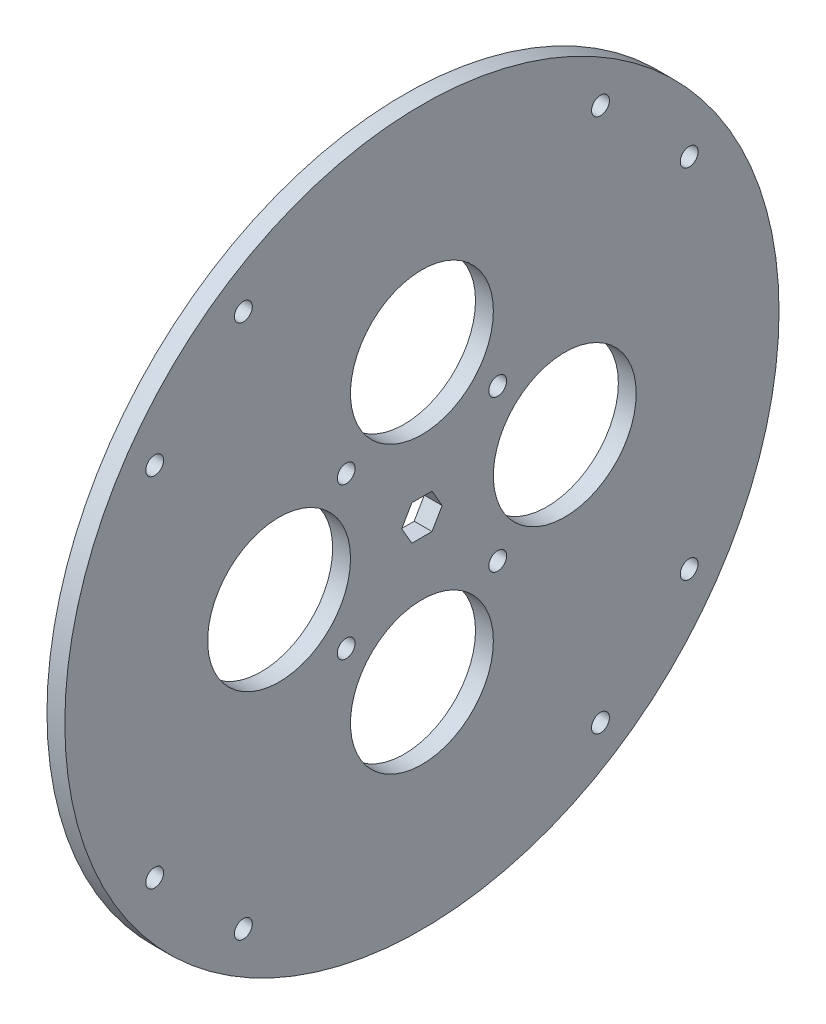
ISO-10303-21;
HEADER;
FILE_DESCRIPTION(('STEP AP214'),'2;1');
FILE_NAME('part.step','',(''),(''),'','','');
FILE_SCHEMA(('AUTOMOTIVE_DESIGN { 1 0 10303 214 1 1 1 1 }'));
ENDSEC;
DATA;
#1=APPLICATION_CONTEXT('core data for automotive mechanical design processes');
#2=APPLICATION_PROTOCOL_DEFINITION('international standard','automotive_design',2000,#1);
#3=PRODUCT_CONTEXT('',#1,'mechanical');
#4=PRODUCT('Part','Part','',(#3));
#5=PRODUCT_RELATED_PRODUCT_CATEGORY('part','',(#4));
#6=PRODUCT_DEFINITION_FORMATION('','',#4);
#7=PRODUCT_DEFINITION_CONTEXT('part definition',#1,'design');
#8=PRODUCT_DEFINITION('design','',#6,#7);
#9=PRODUCT_DEFINITION_SHAPE('','',#8);
#10=(LENGTH_UNIT() NAMED_UNIT(*) SI_UNIT(.MILLI.,.METRE.));
#11=(NAMED_UNIT(*) PLANE_ANGLE_UNIT() SI_UNIT($,.RADIAN.));
#12=(NAMED_UNIT(*) SI_UNIT($,.STERADIAN.) SOLID_ANGLE_UNIT());
#13=UNCERTAINTY_MEASURE_WITH_UNIT(LENGTH_MEASURE(1.E-05),#10,'distance_accuracy_value','');
#14=(GEOMETRIC_REPRESENTATION_CONTEXT(3) GLOBAL_UNCERTAINTY_ASSIGNED_CONTEXT((#13)) GLOBAL_UNIT_ASSIGNED_CONTEXT((#10,
#11,#12)) REPRESENTATION_CONTEXT('',''));
#15=CARTESIAN_POINT('',(0.,0.,0.));
#16=DIRECTION('',(0.,0.,1.));
#17=DIRECTION('',(1.,0.,0.));
#18=AXIS2_PLACEMENT_3D('',#15,#16,#17);
#19=CARTESIAN_POINT('',(6.35,0.,0.));
#20=DIRECTION('',(1.,0.,0.));
#21=DIRECTION('',(0.,0.,-1.));
#22=AXIS2_PLACEMENT_3D('',#19,#20,#21);
#23=PLANE('',#22);
#24=CARTESIAN_POINT('',(6.35,95.0380976240581,63.5));
#25=DIRECTION('',(1.,0.,0.));
#26=DIRECTION('',(0.,0.,-1.));
#27=AXIS2_PLACEMENT_3D('',#24,#25,#26);
#28=CIRCLE('',#27,3.175);
#29=CARTESIAN_POINT('',(6.35,95.0380976240581,60.325));
#30=VERTEX_POINT('',#29);
#31=EDGE_CURVE('E256',#30,#30,#28,.T.);
#32=ORIENTED_EDGE('',*,*,#31,.F.);
#33=EDGE_LOOP('',(#32));
#34=FACE_BOUND('',#33,.T.);
#35=CARTESIAN_POINT('',(6.35,-63.5,-95.0380976240582));
#36=DIRECTION('',(1.,0.,0.));
#37=DIRECTION('',(0.,0.,-1.));
#38=AXIS2_PLACEMENT_3D('',#35,#36,#37);
#39=CIRCLE('',#38,3.175);
#40=CARTESIAN_POINT('',(6.35,-63.5,-98.2130976240582));
#41=VERTEX_POINT('',#40);
#42=EDGE_CURVE('E231',#41,#41,#39,.T.);
#43=ORIENTED_EDGE('',*,*,#42,.F.);
#44=EDGE_LOOP('',(#43));
#45=FACE_BOUND('',#44,.T.);
#46=CARTESIAN_POINT('',(6.35,63.5,-95.0380976240581));
#47=DIRECTION('',(1.,0.,0.));
#48=DIRECTION('',(0.,0.,-1.));
#49=AXIS2_PLACEMENT_3D('',#46,#47,#48);
#50=CIRCLE('',#49,3.175);
#51=CARTESIAN_POINT('',(6.35,63.5,-98.2130976240581));
#52=VERTEX_POINT('',#51);
#53=EDGE_CURVE('E232',#52,#52,#50,.T.);
#54=ORIENTED_EDGE('',*,*,#53,.F.);
#55=EDGE_LOOP('',(#54));
#56=FACE_BOUND('',#55,.T.);
#57=CARTESIAN_POINT('',(6.35,-95.0380976240582,63.5));
#58=DIRECTION('',(1.,0.,0.));
#59=DIRECTION('',(0.,0.,-1.));
#60=AXIS2_PLACEMENT_3D('',#57,#58,#59);
#61=CIRCLE('',#60,3.175);
#62=CARTESIAN_POINT('',(6.35,-95.0380976240582,60.325));
#63=VERTEX_POINT('',#62);
#64=EDGE_CURVE('E247',#63,#63,#61,.T.);
#65=ORIENTED_EDGE('',*,*,#64,.F.);
#66=EDGE_LOOP('',(#65));
#67=FACE_BOUND('',#66,.T.);
#68=CARTESIAN_POINT('',(6.35,26.9407683632075,-26.9407683632075));
#69=DIRECTION('',(1.,0.,0.));
#70=DIRECTION('',(0.,0.,-1.));
#71=AXIS2_PLACEMENT_3D('',#68,#69,#70);
#72=CIRCLE('',#71,3.175);
#73=CARTESIAN_POINT('',(6.35,26.9407683632075,-30.1157683632075));
#74=VERTEX_POINT('',#73);
#75=EDGE_CURVE('E285',#74,#74,#72,.T.);
#76=ORIENTED_EDGE('',*,*,#75,.F.);
#77=EDGE_LOOP('',(#76));
#78=FACE_BOUND('',#77,.T.);
#79=CARTESIAN_POINT('',(6.35,-26.9407683632075,-26.9407683632075));
#80=DIRECTION('',(1.,0.,0.));
#81=DIRECTION('',(0.,0.,-1.));
#82=AXIS2_PLACEMENT_3D('',#79,#80,#81);
#83=CIRCLE('',#82,3.175);
#84=CARTESIAN_POINT('',(6.35,-26.9407683632075,-30.1157683632075));
#85=VERTEX_POINT('',#84);
#86=EDGE_CURVE('E270',#85,#85,#83,.T.);
#87=ORIENTED_EDGE('',*,*,#86,.F.);
#88=EDGE_LOOP('',(#87));
#89=FACE_BOUND('',#88,.T.);
#90=CARTESIAN_POINT('',(6.35,-26.9407683632075,26.9407683632075));
#91=DIRECTION('',(1.,0.,0.));
#92=DIRECTION('',(0.,0.,-1.));
#93=AXIS2_PLACEMENT_3D('',#90,#91,#92);
#94=CIRCLE('',#93,3.175);
#95=CARTESIAN_POINT('',(6.35,-26.9407683632075,23.7657683632075));
#96=VERTEX_POINT('',#95);
#97=EDGE_CURVE('E271',#96,#96,#94,.T.);
#98=ORIENTED_EDGE('',*,*,#97,.F.);
#99=EDGE_LOOP('',(#98));
#100=FACE_BOUND('',#99,.T.);
#101=CARTESIAN_POINT('',(6.35,95.0380976240581,-63.5));
#102=DIRECTION('',(1.,0.,0.));
#103=DIRECTION('',(0.,0.,-1.));
#104=AXIS2_PLACEMENT_3D('',#101,#102,#103);
#105=CIRCLE('',#104,3.175);
#106=CARTESIAN_POINT('',(6.35,95.0380976240581,-66.675));
#107=VERTEX_POINT('',#106);
#108=EDGE_CURVE('E255',#107,#107,#105,.T.);
#109=ORIENTED_EDGE('',*,*,#108,.F.);
#110=EDGE_LOOP('',(#109));
#111=FACE_BOUND('',#110,.T.);
#112=CARTESIAN_POINT('',(6.35,-63.5,95.0380976240581));
#113=DIRECTION('',(1.,0.,0.));
#114=DIRECTION('',(0.,0.,-1.));
#115=AXIS2_PLACEMENT_3D('',#112,#113,#114);
#116=CIRCLE('',#115,3.17499999999998);
#117=CARTESIAN_POINT('',(6.35,-63.5,91.8630976240581));
#118=VERTEX_POINT('',#117);
#119=EDGE_CURVE('E311',#118,#118,#116,.T.);
#120=ORIENTED_EDGE('',*,*,#119,.F.);
#121=EDGE_LOOP('',(#120));
#122=FACE_BOUND('',#121,.T.);
#123=CARTESIAN_POINT('',(6.35,63.5,95.0380976240582));
#124=DIRECTION('',(1.,0.,0.));
#125=DIRECTION('',(0.,0.,-1.));
#126=AXIS2_PLACEMENT_3D('',#123,#124,#125);
#127=CIRCLE('',#126,3.17499999999998);
#128=CARTESIAN_POINT('',(6.35,63.5,91.8630976240582));
#129=VERTEX_POINT('',#128);
#130=EDGE_CURVE('E222',#129,#129,#127,.T.);
#131=ORIENTED_EDGE('',*,*,#130,.F.);
#132=EDGE_LOOP('',(#131));
#133=FACE_BOUND('',#132,.T.);
#134=CARTESIAN_POINT('',(6.35,-95.0380976240581,-63.5));
#135=DIRECTION('',(1.,0.,0.));
#136=DIRECTION('',(0.,0.,-1.));
#137=AXIS2_PLACEMENT_3D('',#134,#135,#136);
#138=CIRCLE('',#137,3.175);
#139=CARTESIAN_POINT('',(6.35,-95.0380976240581,-66.675));
#140=VERTEX_POINT('',#139);
#141=EDGE_CURVE('E212',#140,#140,#138,.T.);
#142=ORIENTED_EDGE('',*,*,#141,.F.);
#143=EDGE_LOOP('',(#142));
#144=FACE_BOUND('',#143,.T.);
#145=CARTESIAN_POINT('',(6.35,26.9407683632075,26.9407683632075));
#146=DIRECTION('',(1.,0.,0.));
#147=DIRECTION('',(0.,0.,-1.));
#148=AXIS2_PLACEMENT_3D('',#145,#146,#147);
#149=CIRCLE('',#148,3.175);
#150=CARTESIAN_POINT('',(6.35,26.9407683632075,23.7657683632075));
#151=VERTEX_POINT('',#150);
#152=EDGE_CURVE('E201',#151,#151,#149,.T.);
#153=ORIENTED_EDGE('',*,*,#152,.F.);
#154=EDGE_LOOP('',(#153));
#155=FACE_BOUND('',#154,.T.);
#156=CARTESIAN_POINT('',(6.35,-50.8,0.));
#157=DIRECTION('',(1.,0.,0.));
#158=DIRECTION('',(0.,0.,-1.));
#159=AXIS2_PLACEMENT_3D('',#156,#157,#158);
#160=CIRCLE('',#159,25.4);
#161=CARTESIAN_POINT('',(6.35,-50.8,-25.4));
#162=VERTEX_POINT('',#161);
#163=EDGE_CURVE('E183',#162,#162,#160,.T.);
#164=ORIENTED_EDGE('',*,*,#163,.F.);
#165=EDGE_LOOP('',(#164));
#166=FACE_BOUND('',#165,.T.);
#167=DIRECTION('',(0.,0.866025403784438,0.5));
#168=VECTOR('',#167,1.);
#169=CARTESIAN_POINT('',(6.35,0.,-7.18570145033408));
#170=LINE('',#169,#168);
#171=CARTESIAN_POINT('',(6.35,0.,-7.18570145033408));
#172=VERTEX_POINT('',#171);
#173=CARTESIAN_POINT('',(6.35,6.223,-3.59285072516704));
#174=VERTEX_POINT('',#173);
#175=EDGE_CURVE('E103',#172,#174,#170,.T.);
#176=ORIENTED_EDGE('',*,*,#175,.F.);
#177=DIRECTION('',(0.,0.866025403784439,-0.5));
#178=VECTOR('',#177,1.);
#179=CARTESIAN_POINT('',(6.35,-6.223,-3.59285072516704));
#180=LINE('',#179,#178);
#181=CARTESIAN_POINT('',(6.35,-6.223,-3.59285072516704));
#182=VERTEX_POINT('',#181);
#183=EDGE_CURVE('E94',#182,#172,#180,.T.);
#184=ORIENTED_EDGE('',*,*,#183,.F.);
#185=DIRECTION('',(0.,0.,-1.));
#186=VECTOR('',#185,1.);
#187=CARTESIAN_POINT('',(6.35,-6.223,3.59285072516704));
#188=LINE('',#187,#186);
#189=CARTESIAN_POINT('',(6.35,-6.223,3.59285072516704));
#190=VERTEX_POINT('',#189);
#191=EDGE_CURVE('E139',#190,#182,#188,.T.);
#192=ORIENTED_EDGE('',*,*,#191,.F.);
#193=DIRECTION('',(0.,-0.866025403784439,-0.5));
#194=VECTOR('',#193,1.);
#195=CARTESIAN_POINT('',(6.35,0.,7.18570145033408));
#196=LINE('',#195,#194);
#197=CARTESIAN_POINT('',(6.35,0.,7.18570145033408));
#198=VERTEX_POINT('',#197);
#199=EDGE_CURVE('E143',#198,#190,#196,.T.);
#200=ORIENTED_EDGE('',*,*,#199,.F.);
#201=DIRECTION('',(0.,-0.866025403784439,0.5));
#202=VECTOR('',#201,1.);
#203=CARTESIAN_POINT('',(6.35,6.223,3.59285072516704));
#204=LINE('',#203,#202);
#205=CARTESIAN_POINT('',(6.35,6.223,3.59285072516704));
#206=VERTEX_POINT('',#205);
#207=EDGE_CURVE('E122',#206,#198,#204,.T.);
#208=ORIENTED_EDGE('',*,*,#207,.F.);
#209=DIRECTION('',(0.,0.,1.));
#210=VECTOR('',#209,1.);
#211=CARTESIAN_POINT('',(6.35,6.223,-3.59285072516704));
#212=LINE('',#211,#210);
#213=EDGE_CURVE('E117',#174,#206,#212,.T.);
#214=ORIENTED_EDGE('',*,*,#213,.F.);
#215=EDGE_LOOP('',(#176,#184,#192,#200,#208,#214));
#216=FACE_BOUND('',#215,.T.);
#217=CARTESIAN_POINT('',(6.35,50.8,0.));
#218=DIRECTION('',(1.,0.,0.));
#219=DIRECTION('',(0.,0.,-1.));
#220=AXIS2_PLACEMENT_3D('',#217,#218,#219);
#221=CIRCLE('',#220,25.4);
#222=CARTESIAN_POINT('',(6.35,50.8,-25.4));
#223=VERTEX_POINT('',#222);
#224=EDGE_CURVE('E166',#223,#223,#221,.T.);
#225=ORIENTED_EDGE('',*,*,#224,.F.);
#226=EDGE_LOOP('',(#225));
#227=FACE_BOUND('',#226,.T.);
#228=CARTESIAN_POINT('',(6.35,0.,0.));
#229=DIRECTION('',(1.,0.,0.));
#230=DIRECTION('',(0.,0.,-1.));
#231=AXIS2_PLACEMENT_3D('',#228,#229,#230);
#232=CIRCLE('',#231,127.);
#233=CARTESIAN_POINT('',(6.35,0.,-127.));
#234=VERTEX_POINT('',#233);
#235=EDGE_CURVE('E12',#234,#234,#232,.T.);
#236=ORIENTED_EDGE('',*,*,#235,.T.);
#237=EDGE_LOOP('',(#236));
#238=FACE_BOUND('',#237,.T.);
#239=CARTESIAN_POINT('',(6.35,0.,-50.8));
#240=DIRECTION('',(1.,0.,0.));
#241=DIRECTION('',(0.,0.,-1.));
#242=AXIS2_PLACEMENT_3D('',#239,#240,#241);
#243=CIRCLE('',#242,25.4);
#244=CARTESIAN_POINT('',(6.35,0.,-76.2));
#245=VERTEX_POINT('',#244);
#246=EDGE_CURVE('E146',#245,#245,#243,.T.);
#247=ORIENTED_EDGE('',*,*,#246,.F.);
#248=EDGE_LOOP('',(#247));
#249=FACE_BOUND('',#248,.T.);
#250=CARTESIAN_POINT('',(6.35,0.,50.8));
#251=DIRECTION('',(1.,0.,0.));
#252=DIRECTION('',(0.,0.,-1.));
#253=AXIS2_PLACEMENT_3D('',#250,#251,#252);
#254=CIRCLE('',#253,25.4);
#255=CARTESIAN_POINT('',(6.35,0.,25.4));
#256=VERTEX_POINT('',#255);
#257=EDGE_CURVE('E191',#256,#256,#254,.T.);
#258=ORIENTED_EDGE('',*,*,#257,.F.);
#259=EDGE_LOOP('',(#258));
#260=FACE_BOUND('',#259,.T.);
#261=ADVANCED_FACE('F40',(#34,#45,#56,#67,#78,#89,#100,#111,#122,#133,#144,#155,#166,#216,#227,
#238,#249,#260),#23,.T.);
#262=CARTESIAN_POINT('',(0.,0.,0.));
#263=DIRECTION('',(1.,0.,0.));
#264=DIRECTION('',(0.,0.,-1.));
#265=AXIS2_PLACEMENT_3D('',#262,#263,#264);
#266=PLANE('',#265);
#267=CARTESIAN_POINT('',(0.,95.0380976240581,63.5));
#268=DIRECTION('',(1.,0.,0.));
#269=DIRECTION('',(0.,0.,-1.));
#270=AXIS2_PLACEMENT_3D('',#267,#268,#269);
#271=CIRCLE('',#270,3.175);
#272=CARTESIAN_POINT('',(0.,95.0380976240581,60.325));
#273=VERTEX_POINT('',#272);
#274=EDGE_CURVE('E252',#273,#273,#271,.T.);
#275=ORIENTED_EDGE('',*,*,#274,.T.);
#276=EDGE_LOOP('',(#275));
#277=FACE_BOUND('',#276,.T.);
#278=CARTESIAN_POINT('',(0.,-63.5,-95.0380976240582));
#279=DIRECTION('',(1.,0.,0.));
#280=DIRECTION('',(0.,0.,-1.));
#281=AXIS2_PLACEMENT_3D('',#278,#279,#280);
#282=CIRCLE('',#281,3.175);
#283=CARTESIAN_POINT('',(0.,-63.5,-98.2130976240582));
#284=VERTEX_POINT('',#283);
#285=EDGE_CURVE('E261',#284,#284,#282,.T.);
#286=ORIENTED_EDGE('',*,*,#285,.T.);
#287=EDGE_LOOP('',(#286));
#288=FACE_BOUND('',#287,.T.);
#289=CARTESIAN_POINT('',(0.,63.5,-95.0380976240581));
#290=DIRECTION('',(1.,0.,0.));
#291=DIRECTION('',(0.,0.,-1.));
#292=AXIS2_PLACEMENT_3D('',#289,#290,#291);
#293=CIRCLE('',#292,3.175);
#294=CARTESIAN_POINT('',(0.,63.5,-98.2130976240581));
#295=VERTEX_POINT('',#294);
#296=EDGE_CURVE('E228',#295,#295,#293,.T.);
#297=ORIENTED_EDGE('',*,*,#296,.T.);
#298=EDGE_LOOP('',(#297));
#299=FACE_BOUND('',#298,.T.);
#300=CARTESIAN_POINT('',(0.,-95.0380976240582,63.5));
#301=DIRECTION('',(1.,0.,0.));
#302=DIRECTION('',(0.,0.,-1.));
#303=AXIS2_PLACEMENT_3D('',#300,#301,#302);
#304=CIRCLE('',#303,3.175);
#305=CARTESIAN_POINT('',(0.,-95.0380976240582,60.325));
#306=VERTEX_POINT('',#305);
#307=EDGE_CURVE('E237',#306,#306,#304,.T.);
#308=ORIENTED_EDGE('',*,*,#307,.T.);
#309=EDGE_LOOP('',(#308));
#310=FACE_BOUND('',#309,.T.);
#311=CARTESIAN_POINT('',(0.,26.9407683632075,-26.9407683632075));
#312=DIRECTION('',(1.,0.,0.));
#313=DIRECTION('',(0.,0.,-1.));
#314=AXIS2_PLACEMENT_3D('',#311,#312,#313);
#315=CIRCLE('',#314,3.175);
#316=CARTESIAN_POINT('',(0.,26.9407683632075,-30.1157683632075));
#317=VERTEX_POINT('',#316);
#318=EDGE_CURVE('E205',#317,#317,#315,.T.);
#319=ORIENTED_EDGE('',*,*,#318,.T.);
#320=EDGE_LOOP('',(#319));
#321=FACE_BOUND('',#320,.T.);
#322=CARTESIAN_POINT('',(0.,-26.9407683632075,-26.9407683632075));
#323=DIRECTION('',(1.,0.,0.));
#324=DIRECTION('',(0.,0.,-1.));
#325=AXIS2_PLACEMENT_3D('',#322,#323,#324);
#326=CIRCLE('',#325,3.175);
#327=CARTESIAN_POINT('',(0.,-26.9407683632075,-30.1157683632075));
#328=VERTEX_POINT('',#327);
#329=EDGE_CURVE('E290',#328,#328,#326,.T.);
#330=ORIENTED_EDGE('',*,*,#329,.T.);
#331=EDGE_LOOP('',(#330));
#332=FACE_BOUND('',#331,.T.);
#333=CARTESIAN_POINT('',(0.,-26.9407683632075,26.9407683632075));
#334=DIRECTION('',(1.,0.,0.));
#335=DIRECTION('',(0.,0.,-1.));
#336=AXIS2_PLACEMENT_3D('',#333,#334,#335);
#337=CIRCLE('',#336,3.175);
#338=CARTESIAN_POINT('',(0.,-26.9407683632075,23.7657683632075));
#339=VERTEX_POINT('',#338);
#340=EDGE_CURVE('E267',#339,#339,#337,.T.);
#341=ORIENTED_EDGE('',*,*,#340,.T.);
#342=EDGE_LOOP('',(#341));
#343=FACE_BOUND('',#342,.T.);
#344=CARTESIAN_POINT('',(0.,95.0380976240581,-63.5));
#345=DIRECTION('',(1.,0.,0.));
#346=DIRECTION('',(0.,0.,-1.));
#347=AXIS2_PLACEMENT_3D('',#344,#345,#346);
#348=CIRCLE('',#347,3.175);
#349=CARTESIAN_POINT('',(0.,95.0380976240581,-66.675));
#350=VERTEX_POINT('',#349);
#351=EDGE_CURVE('E276',#350,#350,#348,.T.);
#352=ORIENTED_EDGE('',*,*,#351,.T.);
#353=EDGE_LOOP('',(#352));
#354=FACE_BOUND('',#353,.T.);
#355=CARTESIAN_POINT('',(0.,-63.5,95.0380976240581));
#356=DIRECTION('',(1.,0.,0.));
#357=DIRECTION('',(0.,0.,-1.));
#358=AXIS2_PLACEMENT_3D('',#355,#356,#357);
#359=CIRCLE('',#358,3.17499999999998);
#360=CARTESIAN_POINT('',(0.,-63.5,91.8630976240581));
#361=VERTEX_POINT('',#360);
#362=EDGE_CURVE('E227',#361,#361,#359,.T.);
#363=ORIENTED_EDGE('',*,*,#362,.T.);
#364=EDGE_LOOP('',(#363));
#365=FACE_BOUND('',#364,.T.);
#366=CARTESIAN_POINT('',(0.,63.5,95.0380976240582));
#367=DIRECTION('',(1.,0.,0.));
#368=DIRECTION('',(0.,0.,-1.));
#369=AXIS2_PLACEMENT_3D('',#366,#367,#368);
#370=CIRCLE('',#369,3.17499999999998);
#371=CARTESIAN_POINT('',(0.,63.5,91.8630976240582));
#372=VERTEX_POINT('',#371);
#373=EDGE_CURVE('E219',#372,#372,#370,.T.);
#374=ORIENTED_EDGE('',*,*,#373,.T.);
#375=EDGE_LOOP('',(#374));
#376=FACE_BOUND('',#375,.T.);
#377=CARTESIAN_POINT('',(0.,-95.0380976240581,-63.5));
#378=DIRECTION('',(1.,0.,0.));
#379=DIRECTION('',(0.,0.,-1.));
#380=AXIS2_PLACEMENT_3D('',#377,#378,#379);
#381=CIRCLE('',#380,3.175);
#382=CARTESIAN_POINT('',(0.,-95.0380976240581,-66.675));
#383=VERTEX_POINT('',#382);
#384=EDGE_CURVE('E218',#383,#383,#381,.T.);
#385=ORIENTED_EDGE('',*,*,#384,.T.);
#386=EDGE_LOOP('',(#385));
#387=FACE_BOUND('',#386,.T.);
#388=CARTESIAN_POINT('',(0.,26.9407683632075,26.9407683632075));
#389=DIRECTION('',(1.,0.,0.));
#390=DIRECTION('',(0.,0.,-1.));
#391=AXIS2_PLACEMENT_3D('',#388,#389,#390);
#392=CIRCLE('',#391,3.175);
#393=CARTESIAN_POINT('',(0.,26.9407683632075,23.7657683632075));
#394=VERTEX_POINT('',#393);
#395=EDGE_CURVE('E196',#394,#394,#392,.T.);
#396=ORIENTED_EDGE('',*,*,#395,.T.);
#397=EDGE_LOOP('',(#396));
#398=FACE_BOUND('',#397,.T.);
#399=CARTESIAN_POINT('',(0.,50.8,0.));
#400=DIRECTION('',(1.,0.,0.));
#401=DIRECTION('',(0.,0.,-1.));
#402=AXIS2_PLACEMENT_3D('',#399,#400,#401);
#403=CIRCLE('',#402,25.4);
#404=CARTESIAN_POINT('',(0.,50.8,-25.4));
#405=VERTEX_POINT('',#404);
#406=EDGE_CURVE('E111',#405,#405,#403,.T.);
#407=ORIENTED_EDGE('',*,*,#406,.T.);
#408=EDGE_LOOP('',(#407));
#409=FACE_BOUND('',#408,.T.);
#410=CARTESIAN_POINT('',(0.,0.,0.));
#411=DIRECTION('',(1.,0.,0.));
#412=DIRECTION('',(0.,0.,-1.));
#413=AXIS2_PLACEMENT_3D('',#410,#411,#412);
#414=CIRCLE('',#413,127.);
#415=CARTESIAN_POINT('',(0.,0.,-127.));
#416=VERTEX_POINT('',#415);
#417=EDGE_CURVE('E44',#416,#416,#414,.T.);
#418=ORIENTED_EDGE('',*,*,#417,.F.);
#419=EDGE_LOOP('',(#418));
#420=FACE_BOUND('',#419,.T.);
#421=DIRECTION('',(0.,0.866025403784439,-0.5));
#422=VECTOR('',#421,1.);
#423=CARTESIAN_POINT('',(0.,-6.223,-3.59285072516704));
#424=LINE('',#423,#422);
#425=CARTESIAN_POINT('',(0.,-6.223,-3.59285072516704));
#426=VERTEX_POINT('',#425);
#427=CARTESIAN_POINT('',(0.,0.,-7.18570145033408));
#428=VERTEX_POINT('',#427);
#429=EDGE_CURVE('E64',#426,#428,#424,.T.);
#430=ORIENTED_EDGE('',*,*,#429,.T.);
#431=DIRECTION('',(0.,0.866025403784438,0.5));
#432=VECTOR('',#431,1.);
#433=CARTESIAN_POINT('',(0.,0.,-7.18570145033408));
#434=LINE('',#433,#432);
#435=CARTESIAN_POINT('',(0.,6.223,-3.59285072516704));
#436=VERTEX_POINT('',#435);
#437=EDGE_CURVE('E110',#428,#436,#434,.T.);
#438=ORIENTED_EDGE('',*,*,#437,.T.);
#439=DIRECTION('',(0.,0.,1.));
#440=VECTOR('',#439,1.);
#441=CARTESIAN_POINT('',(0.,6.223,-3.59285072516704));
#442=LINE('',#441,#440);
#443=CARTESIAN_POINT('',(0.,6.223,3.59285072516704));
#444=VERTEX_POINT('',#443);
#445=EDGE_CURVE('E148',#436,#444,#442,.T.);
#446=ORIENTED_EDGE('',*,*,#445,.T.);
#447=DIRECTION('',(0.,-0.866025403784439,0.5));
#448=VECTOR('',#447,1.);
#449=CARTESIAN_POINT('',(0.,6.223,3.59285072516704));
#450=LINE('',#449,#448);
#451=CARTESIAN_POINT('',(0.,0.,7.18570145033408));
#452=VERTEX_POINT('',#451);
#453=EDGE_CURVE('E151',#444,#452,#450,.T.);
#454=ORIENTED_EDGE('',*,*,#453,.T.);
#455=DIRECTION('',(0.,-0.866025403784439,-0.5));
#456=VECTOR('',#455,1.);
#457=CARTESIAN_POINT('',(0.,0.,7.18570145033408));
#458=LINE('',#457,#456);
#459=CARTESIAN_POINT('',(0.,-6.223,3.59285072516704));
#460=VERTEX_POINT('',#459);
#461=EDGE_CURVE('E154',#452,#460,#458,.T.);
#462=ORIENTED_EDGE('',*,*,#461,.T.);
#463=DIRECTION('',(0.,0.,-1.));
#464=VECTOR('',#463,1.);
#465=CARTESIAN_POINT('',(0.,-6.223,3.59285072516704));
#466=LINE('',#465,#464);
#467=EDGE_CURVE('E104',#460,#426,#466,.T.);
#468=ORIENTED_EDGE('',*,*,#467,.T.);
#469=EDGE_LOOP('',(#430,#438,#446,#454,#462,#468));
#470=FACE_BOUND('',#469,.T.);
#471=CARTESIAN_POINT('',(0.,0.,-50.8));
#472=DIRECTION('',(1.,0.,0.));
#473=DIRECTION('',(0.,0.,-1.));
#474=AXIS2_PLACEMENT_3D('',#471,#472,#473);
#475=CIRCLE('',#474,25.4);
#476=CARTESIAN_POINT('',(0.,0.,-76.2));
#477=VERTEX_POINT('',#476);
#478=EDGE_CURVE('E180',#477,#477,#475,.T.);
#479=ORIENTED_EDGE('',*,*,#478,.T.);
#480=EDGE_LOOP('',(#479));
#481=FACE_BOUND('',#480,.T.);
#482=CARTESIAN_POINT('',(0.,-50.8,0.));
#483=DIRECTION('',(1.,0.,0.));
#484=DIRECTION('',(0.,0.,-1.));
#485=AXIS2_PLACEMENT_3D('',#482,#483,#484);
#486=CIRCLE('',#485,25.4);
#487=CARTESIAN_POINT('',(0.,-50.8,-25.4));
#488=VERTEX_POINT('',#487);
#489=EDGE_CURVE('E181',#488,#488,#486,.T.);
#490=ORIENTED_EDGE('',*,*,#489,.T.);
#491=EDGE_LOOP('',(#490));
#492=FACE_BOUND('',#491,.T.);
#493=CARTESIAN_POINT('',(0.,0.,50.8));
#494=DIRECTION('',(1.,0.,0.));
#495=DIRECTION('',(0.,0.,-1.));
#496=AXIS2_PLACEMENT_3D('',#493,#494,#495);
#497=CIRCLE('',#496,25.4);
#498=CARTESIAN_POINT('',(0.,0.,25.4));
#499=VERTEX_POINT('',#498);
#500=EDGE_CURVE('E194',#499,#499,#497,.T.);
#501=ORIENTED_EDGE('',*,*,#500,.T.);
#502=EDGE_LOOP('',(#501));
#503=FACE_BOUND('',#502,.T.);
#504=ADVANCED_FACE('F301',(#277,#288,#299,#310,#321,#332,#343,#354,#365,#376,#387,#398,#409,
#420,#470,#481,#492,#503),#266,.F.);
#505=CARTESIAN_POINT('',(6.35,0.,0.));
#506=DIRECTION('',(-1.,0.,0.));
#507=DIRECTION('',(0.,0.,1.));
#508=AXIS2_PLACEMENT_3D('',#505,#506,#507);
#509=CYLINDRICAL_SURFACE('',#508,127.);
#510=ORIENTED_EDGE('',*,*,#235,.F.);
#511=EDGE_LOOP('',(#510));
#512=FACE_BOUND('',#511,.T.);
#513=ORIENTED_EDGE('',*,*,#417,.T.);
#514=EDGE_LOOP('',(#513));
#515=FACE_BOUND('',#514,.T.);
#516=ADVANCED_FACE('F42',(#512,#515),#509,.T.);
#517=CARTESIAN_POINT('',(6.35,50.8,0.));
#518=DIRECTION('',(-1.,0.,0.));
#519=DIRECTION('',(0.,0.,1.));
#520=AXIS2_PLACEMENT_3D('',#517,#518,#519);
#521=CYLINDRICAL_SURFACE('',#520,25.4);
#522=ORIENTED_EDGE('',*,*,#224,.T.);
#523=EDGE_LOOP('',(#522));
#524=FACE_BOUND('',#523,.T.);
#525=ORIENTED_EDGE('',*,*,#406,.F.);
#526=EDGE_LOOP('',(#525));
#527=FACE_BOUND('',#526,.T.);
#528=ADVANCED_FACE('F364',(#524,#527),#521,.F.);
#529=CARTESIAN_POINT('',(6.35,-6.223,-3.59285072516704));
#530=DIRECTION('',(0.,0.5,0.866025403784439));
#531=DIRECTION('',(0.,-0.866025403784439,0.5));
#532=AXIS2_PLACEMENT_3D('',#529,#530,#531);
#533=PLANE('',#532);
#534=ORIENTED_EDGE('',*,*,#429,.F.);
#535=DIRECTION('',(-1.,0.,0.));
#536=VECTOR('',#535,1.);
#537=CARTESIAN_POINT('',(6.35,-6.223,-3.59285072516704));
#538=LINE('',#537,#536);
#539=EDGE_CURVE('E98',#182,#426,#538,.T.);
#540=ORIENTED_EDGE('',*,*,#539,.F.);
#541=ORIENTED_EDGE('',*,*,#183,.T.);
#542=DIRECTION('',(-1.,0.,0.));
#543=VECTOR('',#542,1.);
#544=CARTESIAN_POINT('',(6.35,0.,-7.18570145033408));
#545=LINE('',#544,#543);
#546=EDGE_CURVE('E97',#172,#428,#545,.T.);
#547=ORIENTED_EDGE('',*,*,#546,.T.);
#548=EDGE_LOOP('',(#534,#540,#541,#547));
#549=FACE_BOUND('',#548,.T.);
#550=ADVANCED_FACE('F96',(#549),#533,.T.);
#551=CARTESIAN_POINT('',(6.35,0.,-7.18570145033408));
#552=DIRECTION('',(0.,-0.5,0.866025403784439));
#553=DIRECTION('',(0.,-0.866025403784439,-0.5));
#554=AXIS2_PLACEMENT_3D('',#551,#552,#553);
#555=PLANE('',#554);
#556=ORIENTED_EDGE('',*,*,#437,.F.);
#557=ORIENTED_EDGE('',*,*,#546,.F.);
#558=ORIENTED_EDGE('',*,*,#175,.T.);
#559=DIRECTION('',(-1.,0.,0.));
#560=VECTOR('',#559,1.);
#561=CARTESIAN_POINT('',(6.35,6.223,-3.59285072516704));
#562=LINE('',#561,#560);
#563=EDGE_CURVE('E112',#174,#436,#562,.T.);
#564=ORIENTED_EDGE('',*,*,#563,.T.);
#565=EDGE_LOOP('',(#556,#557,#558,#564));
#566=FACE_BOUND('',#565,.T.);
#567=ADVANCED_FACE('F107',(#566),#555,.T.);
#568=CARTESIAN_POINT('',(6.35,6.223,-3.59285072516704));
#569=DIRECTION('',(0.,-1.,0.));
#570=DIRECTION('',(0.,0.,-1.));
#571=AXIS2_PLACEMENT_3D('',#568,#569,#570);
#572=PLANE('',#571);
#573=ORIENTED_EDGE('',*,*,#445,.F.);
#574=ORIENTED_EDGE('',*,*,#563,.F.);
#575=ORIENTED_EDGE('',*,*,#213,.T.);
#576=DIRECTION('',(-1.,0.,0.));
#577=VECTOR('',#576,1.);
#578=CARTESIAN_POINT('',(6.35,6.223,3.59285072516704));
#579=LINE('',#578,#577);
#580=EDGE_CURVE('E163',#206,#444,#579,.T.);
#581=ORIENTED_EDGE('',*,*,#580,.T.);
#582=EDGE_LOOP('',(#573,#574,#575,#581));
#583=FACE_BOUND('',#582,.T.);
#584=ADVANCED_FACE('F355',(#583),#572,.T.);
#585=CARTESIAN_POINT('',(6.35,6.223,3.59285072516704));
#586=DIRECTION('',(0.,-0.5,-0.866025403784439));
#587=DIRECTION('',(0.,0.866025403784439,-0.5));
#588=AXIS2_PLACEMENT_3D('',#585,#586,#587);
#589=PLANE('',#588);
#590=ORIENTED_EDGE('',*,*,#453,.F.);
#591=ORIENTED_EDGE('',*,*,#580,.F.);
#592=ORIENTED_EDGE('',*,*,#207,.T.);
#593=DIRECTION('',(-1.,0.,0.));
#594=VECTOR('',#593,1.);
#595=CARTESIAN_POINT('',(6.35,0.,7.18570145033408));
#596=LINE('',#595,#594);
#597=EDGE_CURVE('E161',#198,#452,#596,.T.);
#598=ORIENTED_EDGE('',*,*,#597,.T.);
#599=EDGE_LOOP('',(#590,#591,#592,#598));
#600=FACE_BOUND('',#599,.T.);
#601=ADVANCED_FACE('F351',(#600),#589,.T.);
#602=CARTESIAN_POINT('',(6.35,0.,7.18570145033408));
#603=DIRECTION('',(0.,0.5,-0.866025403784438));
#604=DIRECTION('',(0.,0.866025403784439,0.5));
#605=AXIS2_PLACEMENT_3D('',#602,#603,#604);
#606=PLANE('',#605);
#607=ORIENTED_EDGE('',*,*,#461,.F.);
#608=ORIENTED_EDGE('',*,*,#597,.F.);
#609=ORIENTED_EDGE('',*,*,#199,.T.);
#610=DIRECTION('',(-1.,0.,0.));
#611=VECTOR('',#610,1.);
#612=CARTESIAN_POINT('',(6.35,-6.223,3.59285072516704));
#613=LINE('',#612,#611);
#614=EDGE_CURVE('E56',#190,#460,#613,.T.);
#615=ORIENTED_EDGE('',*,*,#614,.T.);
#616=EDGE_LOOP('',(#607,#608,#609,#615));
#617=FACE_BOUND('',#616,.T.);
#618=ADVANCED_FACE('F348',(#617),#606,.T.);
#619=CARTESIAN_POINT('',(6.35,-6.223,3.59285072516704));
#620=DIRECTION('',(0.,1.,0.));
#621=DIRECTION('',(0.,0.,1.));
#622=AXIS2_PLACEMENT_3D('',#619,#620,#621);
#623=PLANE('',#622);
#624=ORIENTED_EDGE('',*,*,#467,.F.);
#625=ORIENTED_EDGE('',*,*,#614,.F.);
#626=ORIENTED_EDGE('',*,*,#191,.T.);
#627=ORIENTED_EDGE('',*,*,#539,.T.);
#628=EDGE_LOOP('',(#624,#625,#626,#627));
#629=FACE_BOUND('',#628,.T.);
#630=ADVANCED_FACE('F344',(#629),#623,.T.);
#631=CARTESIAN_POINT('',(6.35,0.,-50.8));
#632=DIRECTION('',(-1.,0.,0.));
#633=DIRECTION('',(0.,0.,1.));
#634=AXIS2_PLACEMENT_3D('',#631,#632,#633);
#635=CYLINDRICAL_SURFACE('',#634,25.4);
#636=ORIENTED_EDGE('',*,*,#246,.T.);
#637=EDGE_LOOP('',(#636));
#638=FACE_BOUND('',#637,.T.);
#639=ORIENTED_EDGE('',*,*,#478,.F.);
#640=EDGE_LOOP('',(#639));
#641=FACE_BOUND('',#640,.T.);
#642=ADVANCED_FACE('F341',(#638,#641),#635,.F.);
#643=CARTESIAN_POINT('',(6.35,-50.8,0.));
#644=DIRECTION('',(-1.,0.,0.));
#645=DIRECTION('',(0.,0.,1.));
#646=AXIS2_PLACEMENT_3D('',#643,#644,#645);
#647=CYLINDRICAL_SURFACE('',#646,25.4);
#648=ORIENTED_EDGE('',*,*,#163,.T.);
#649=EDGE_LOOP('',(#648));
#650=FACE_BOUND('',#649,.T.);
#651=ORIENTED_EDGE('',*,*,#489,.F.);
#652=EDGE_LOOP('',(#651));
#653=FACE_BOUND('',#652,.T.);
#654=ADVANCED_FACE('F332',(#650,#653),#647,.F.);
#655=CARTESIAN_POINT('',(6.35,0.,50.8));
#656=DIRECTION('',(-1.,0.,0.));
#657=DIRECTION('',(0.,0.,1.));
#658=AXIS2_PLACEMENT_3D('',#655,#656,#657);
#659=CYLINDRICAL_SURFACE('',#658,25.4);
#660=ORIENTED_EDGE('',*,*,#257,.T.);
#661=EDGE_LOOP('',(#660));
#662=FACE_BOUND('',#661,.T.);
#663=ORIENTED_EDGE('',*,*,#500,.F.);
#664=EDGE_LOOP('',(#663));
#665=FACE_BOUND('',#664,.T.);
#666=ADVANCED_FACE('F322',(#662,#665),#659,.F.);
#667=CARTESIAN_POINT('',(0.,26.9407683632075,26.9407683632075));
#668=DIRECTION('',(1.,0.,0.));
#669=DIRECTION('',(0.,0.,-1.));
#670=AXIS2_PLACEMENT_3D('',#667,#668,#669);
#671=CYLINDRICAL_SURFACE('',#670,3.175);
#672=ORIENTED_EDGE('',*,*,#395,.F.);
#673=EDGE_LOOP('',(#672));
#674=FACE_BOUND('',#673,.T.);
#675=ORIENTED_EDGE('',*,*,#152,.T.);
#676=EDGE_LOOP('',(#675));
#677=FACE_BOUND('',#676,.T.);
#678=ADVANCED_FACE('F319',(#674,#677),#671,.F.);
#679=CARTESIAN_POINT('',(0.,-95.0380976240581,-63.5));
#680=DIRECTION('',(1.,0.,0.));
#681=DIRECTION('',(0.,0.,-1.));
#682=AXIS2_PLACEMENT_3D('',#679,#680,#681);
#683=CYLINDRICAL_SURFACE('',#682,3.175);
#684=ORIENTED_EDGE('',*,*,#384,.F.);
#685=EDGE_LOOP('',(#684));
#686=FACE_BOUND('',#685,.T.);
#687=ORIENTED_EDGE('',*,*,#141,.T.);
#688=EDGE_LOOP('',(#687));
#689=FACE_BOUND('',#688,.T.);
#690=ADVANCED_FACE('F321',(#686,#689),#683,.F.);
#691=CARTESIAN_POINT('',(0.,63.5,95.0380976240582));
#692=DIRECTION('',(1.,0.,0.));
#693=DIRECTION('',(0.,0.,-1.));
#694=AXIS2_PLACEMENT_3D('',#691,#692,#693);
#695=CYLINDRICAL_SURFACE('',#694,3.17499999999998);
#696=ORIENTED_EDGE('',*,*,#373,.F.);
#697=EDGE_LOOP('',(#696));
#698=FACE_BOUND('',#697,.T.);
#699=ORIENTED_EDGE('',*,*,#130,.T.);
#700=EDGE_LOOP('',(#699));
#701=FACE_BOUND('',#700,.T.);
#702=ADVANCED_FACE('F329',(#698,#701),#695,.F.);
#703=CARTESIAN_POINT('',(0.,-63.5,95.0380976240581));
#704=DIRECTION('',(1.,0.,0.));
#705=DIRECTION('',(0.,0.,-1.));
#706=AXIS2_PLACEMENT_3D('',#703,#704,#705);
#707=CYLINDRICAL_SURFACE('',#706,3.17499999999998);
#708=ORIENTED_EDGE('',*,*,#362,.F.);
#709=EDGE_LOOP('',(#708));
#710=FACE_BOUND('',#709,.T.);
#711=ORIENTED_EDGE('',*,*,#119,.T.);
#712=EDGE_LOOP('',(#711));
#713=FACE_BOUND('',#712,.T.);
#714=ADVANCED_FACE('F428',(#710,#713),#707,.F.);
#715=CARTESIAN_POINT('',(0.,95.0380976240581,-63.5));
#716=DIRECTION('',(1.,0.,0.));
#717=DIRECTION('',(0.,0.,-1.));
#718=AXIS2_PLACEMENT_3D('',#715,#716,#717);
#719=CYLINDRICAL_SURFACE('',#718,3.175);
#720=ORIENTED_EDGE('',*,*,#351,.F.);
#721=EDGE_LOOP('',(#720));
#722=FACE_BOUND('',#721,.T.);
#723=ORIENTED_EDGE('',*,*,#108,.T.);
#724=EDGE_LOOP('',(#723));
#725=FACE_BOUND('',#724,.T.);
#726=ADVANCED_FACE('F433',(#722,#725),#719,.F.);
#727=CARTESIAN_POINT('',(0.,-26.9407683632075,26.9407683632075));
#728=DIRECTION('',(1.,0.,0.));
#729=DIRECTION('',(0.,0.,-1.));
#730=AXIS2_PLACEMENT_3D('',#727,#728,#729);
#731=CYLINDRICAL_SURFACE('',#730,3.175);
#732=ORIENTED_EDGE('',*,*,#340,.F.);
#733=EDGE_LOOP('',(#732));
#734=FACE_BOUND('',#733,.T.);
#735=ORIENTED_EDGE('',*,*,#97,.T.);
#736=EDGE_LOOP('',(#735));
#737=FACE_BOUND('',#736,.T.);
#738=ADVANCED_FACE('F454',(#734,#737),#731,.F.);
#739=CARTESIAN_POINT('',(0.,-26.9407683632075,-26.9407683632075));
#740=DIRECTION('',(1.,0.,0.));
#741=DIRECTION('',(0.,0.,-1.));
#742=AXIS2_PLACEMENT_3D('',#739,#740,#741);
#743=CYLINDRICAL_SURFACE('',#742,3.175);
#744=ORIENTED_EDGE('',*,*,#329,.F.);
#745=EDGE_LOOP('',(#744));
#746=FACE_BOUND('',#745,.T.);
#747=ORIENTED_EDGE('',*,*,#86,.T.);
#748=EDGE_LOOP('',(#747));
#749=FACE_BOUND('',#748,.T.);
#750=ADVANCED_FACE('F297',(#746,#749),#743,.F.);
#751=CARTESIAN_POINT('',(0.,26.9407683632075,-26.9407683632075));
#752=DIRECTION('',(1.,0.,0.));
#753=DIRECTION('',(0.,0.,-1.));
#754=AXIS2_PLACEMENT_3D('',#751,#752,#753);
#755=CYLINDRICAL_SURFACE('',#754,3.175);
#756=ORIENTED_EDGE('',*,*,#318,.F.);
#757=EDGE_LOOP('',(#756));
#758=FACE_BOUND('',#757,.T.);
#759=ORIENTED_EDGE('',*,*,#75,.T.);
#760=EDGE_LOOP('',(#759));
#761=FACE_BOUND('',#760,.T.);
#762=ADVANCED_FACE('F445',(#758,#761),#755,.F.);
#763=CARTESIAN_POINT('',(0.,-95.0380976240582,63.5));
#764=DIRECTION('',(1.,0.,0.));
#765=DIRECTION('',(0.,0.,-1.));
#766=AXIS2_PLACEMENT_3D('',#763,#764,#765);
#767=CYLINDRICAL_SURFACE('',#766,3.175);
#768=ORIENTED_EDGE('',*,*,#307,.F.);
#769=EDGE_LOOP('',(#768));
#770=FACE_BOUND('',#769,.T.);
#771=ORIENTED_EDGE('',*,*,#64,.T.);
#772=EDGE_LOOP('',(#771));
#773=FACE_BOUND('',#772,.T.);
#774=ADVANCED_FACE('F441',(#770,#773),#767,.F.);
#775=CARTESIAN_POINT('',(0.,63.5,-95.0380976240581));
#776=DIRECTION('',(1.,0.,0.));
#777=DIRECTION('',(0.,0.,-1.));
#778=AXIS2_PLACEMENT_3D('',#775,#776,#777);
#779=CYLINDRICAL_SURFACE('',#778,3.175);
#780=ORIENTED_EDGE('',*,*,#296,.F.);
#781=EDGE_LOOP('',(#780));
#782=FACE_BOUND('',#781,.T.);
#783=ORIENTED_EDGE('',*,*,#53,.T.);
#784=EDGE_LOOP('',(#783));
#785=FACE_BOUND('',#784,.T.);
#786=ADVANCED_FACE('F437',(#782,#785),#779,.F.);
#787=CARTESIAN_POINT('',(0.,-63.5,-95.0380976240582));
#788=DIRECTION('',(1.,0.,0.));
#789=DIRECTION('',(0.,0.,-1.));
#790=AXIS2_PLACEMENT_3D('',#787,#788,#789);
#791=CYLINDRICAL_SURFACE('',#790,3.175);
#792=ORIENTED_EDGE('',*,*,#285,.F.);
#793=EDGE_LOOP('',(#792));
#794=FACE_BOUND('',#793,.T.);
#795=ORIENTED_EDGE('',*,*,#42,.T.);
#796=EDGE_LOOP('',(#795));
#797=FACE_BOUND('',#796,.T.);
#798=ADVANCED_FACE('F440',(#794,#797),#791,.F.);
#799=CARTESIAN_POINT('',(0.,95.0380976240581,63.5));
#800=DIRECTION('',(1.,0.,0.));
#801=DIRECTION('',(0.,0.,-1.));
#802=AXIS2_PLACEMENT_3D('',#799,#800,#801);
#803=CYLINDRICAL_SURFACE('',#802,3.175);
#804=ORIENTED_EDGE('',*,*,#274,.F.);
#805=EDGE_LOOP('',(#804));
#806=FACE_BOUND('',#805,.T.);
#807=ORIENTED_EDGE('',*,*,#31,.T.);
#808=EDGE_LOOP('',(#807));
#809=FACE_BOUND('',#808,.T.);
#810=ADVANCED_FACE('F447',(#806,#809),#803,.F.);
#811=CLOSED_SHELL('',(#261,#504,#516,#528,#550,#567,#584,#601,#618,#630,#642,#654,#666,#678,
#690,#702,#714,#726,#738,#750,#762,#774,#786,#798,#810));
#812=MANIFOLD_SOLID_BREP('B2',#811);
#813=ADVANCED_BREP_SHAPE_REPRESENTATION('',(#18,#812),#14);
#814=SHAPE_DEFINITION_REPRESENTATION(#9,#813);
ENDSEC;
END-ISO-10303-21;
